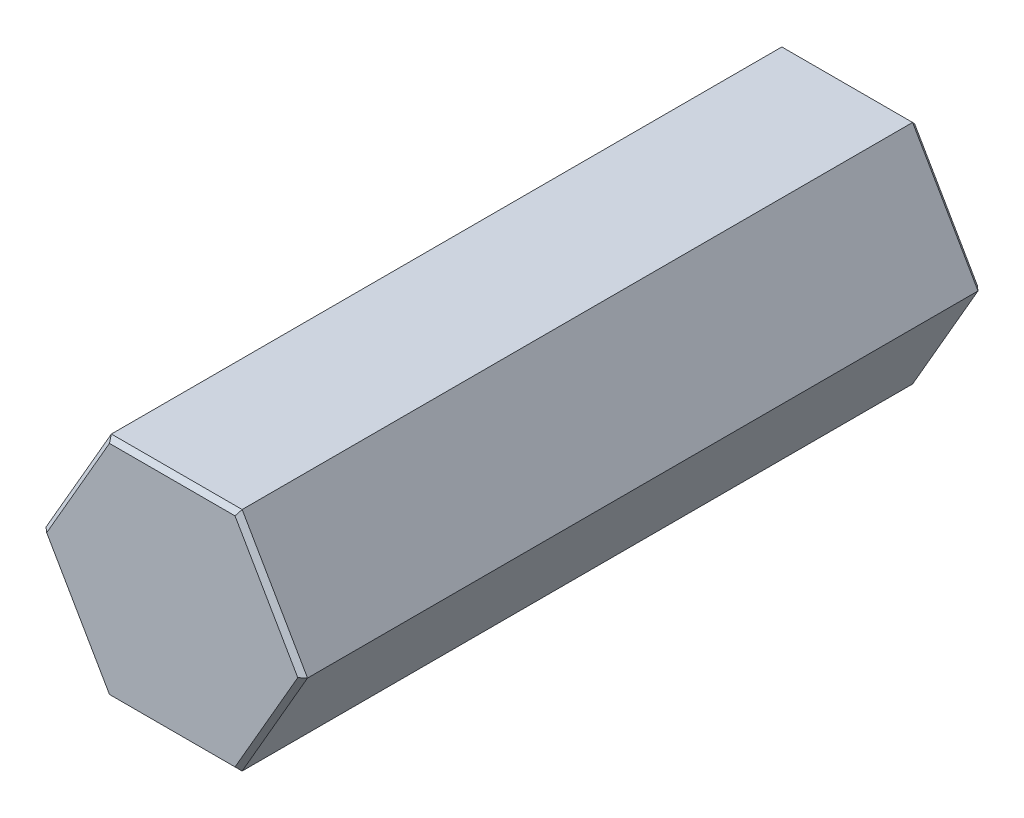
ISO-10303-21;
HEADER;
FILE_DESCRIPTION(('STEP AP214'),'2;1');
FILE_NAME('part.step','',(''),(''),'','','');
FILE_SCHEMA(('AUTOMOTIVE_DESIGN { 1 0 10303 214 1 1 1 1 }'));
ENDSEC;
DATA;
#1=APPLICATION_CONTEXT('core data for automotive mechanical design processes');
#2=APPLICATION_PROTOCOL_DEFINITION('international standard','automotive_design',2000,#1);
#3=PRODUCT_CONTEXT('',#1,'mechanical');
#4=PRODUCT('Part','Part','',(#3));
#5=PRODUCT_RELATED_PRODUCT_CATEGORY('part','',(#4));
#6=PRODUCT_DEFINITION_FORMATION('','',#4);
#7=PRODUCT_DEFINITION_CONTEXT('part definition',#1,'design');
#8=PRODUCT_DEFINITION('design','',#6,#7);
#9=PRODUCT_DEFINITION_SHAPE('','',#8);
#10=(LENGTH_UNIT() NAMED_UNIT(*) SI_UNIT(.MILLI.,.METRE.));
#11=(NAMED_UNIT(*) PLANE_ANGLE_UNIT() SI_UNIT($,.RADIAN.));
#12=(NAMED_UNIT(*) SI_UNIT($,.STERADIAN.) SOLID_ANGLE_UNIT());
#13=UNCERTAINTY_MEASURE_WITH_UNIT(LENGTH_MEASURE(1.E-05),#10,'distance_accuracy_value','');
#14=(GEOMETRIC_REPRESENTATION_CONTEXT(3) GLOBAL_UNCERTAINTY_ASSIGNED_CONTEXT((#13)) GLOBAL_UNIT_ASSIGNED_CONTEXT((#10,
#11,#12)) REPRESENTATION_CONTEXT('',''));
#15=CARTESIAN_POINT('',(0.,0.,0.));
#16=DIRECTION('',(0.,0.,1.));
#17=DIRECTION('',(1.,0.,0.));
#18=AXIS2_PLACEMENT_3D('',#15,#16,#17);
#19=CARTESIAN_POINT('',(-7.33234841870824,0.,38.1));
#20=DIRECTION('',(-0.866025403784439,0.5,0.));
#21=DIRECTION('',(-0.5,-0.866025403784439,0.));
#22=AXIS2_PLACEMENT_3D('',#19,#20,#21);
#23=PLANE('',#22);
#24=DIRECTION('',(0.,0.,-1.));
#25=VECTOR('',#24,1.);
#26=CARTESIAN_POINT('',(-3.66617420935412,6.35,38.1));
#27=LINE('',#26,#25);
#28=CARTESIAN_POINT('',(-3.66617420935412,6.35,37.846));
#29=VERTEX_POINT('',#28);
#30=CARTESIAN_POINT('',(-3.66617420935412,6.35,0.254000000000039));
#31=VERTEX_POINT('',#30);
#32=EDGE_CURVE('E168',#29,#31,#27,.T.);
#33=ORIENTED_EDGE('',*,*,#32,.T.);
#34=DIRECTION('',(-0.5,-0.866025403784439,0.));
#35=VECTOR('',#34,1.);
#36=CARTESIAN_POINT('',(-7.33234841870824,0.,0.254000000000025));
#37=LINE('',#36,#35);
#38=CARTESIAN_POINT('',(-7.33234841870824,0.,0.254000000000039));
#39=VERTEX_POINT('',#38);
#40=EDGE_CURVE('E162',#31,#39,#37,.T.);
#41=ORIENTED_EDGE('',*,*,#40,.T.);
#42=DIRECTION('',(0.,0.,-1.));
#43=VECTOR('',#42,1.);
#44=CARTESIAN_POINT('',(-7.33234841870824,0.,38.1));
#45=LINE('',#44,#43);
#46=CARTESIAN_POINT('',(-7.33234841870824,0.,37.846));
#47=VERTEX_POINT('',#46);
#48=EDGE_CURVE('E159',#47,#39,#45,.T.);
#49=ORIENTED_EDGE('',*,*,#48,.F.);
#50=DIRECTION('',(0.5,0.866025403784439,0.));
#51=VECTOR('',#50,1.);
#52=CARTESIAN_POINT('',(-3.66617420935412,6.35,37.846));
#53=LINE('',#52,#51);
#54=EDGE_CURVE('E235',#47,#29,#53,.T.);
#55=ORIENTED_EDGE('',*,*,#54,.T.);
#56=EDGE_LOOP('',(#33,#41,#49,#55));
#57=FACE_BOUND('',#56,.T.);
#58=ADVANCED_FACE('F41',(#57),#23,.T.);
#59=CARTESIAN_POINT('',(-3.66617420935412,-6.35,38.1));
#60=DIRECTION('',(-0.866025403784439,-0.5,0.));
#61=DIRECTION('',(0.5,-0.866025403784439,0.));
#62=AXIS2_PLACEMENT_3D('',#59,#60,#61);
#63=PLANE('',#62);
#64=ORIENTED_EDGE('',*,*,#48,.T.);
#65=DIRECTION('',(0.5,-0.866025403784439,0.));
#66=VECTOR('',#65,1.);
#67=CARTESIAN_POINT('',(-3.66617420935412,-6.35,0.254000000000025));
#68=LINE('',#67,#66);
#69=CARTESIAN_POINT('',(-3.66617420935412,-6.35,0.254000000000039));
#70=VERTEX_POINT('',#69);
#71=EDGE_CURVE('E215',#39,#70,#68,.T.);
#72=ORIENTED_EDGE('',*,*,#71,.T.);
#73=DIRECTION('',(0.,0.,-1.));
#74=VECTOR('',#73,1.);
#75=CARTESIAN_POINT('',(-3.66617420935412,-6.35,38.1));
#76=LINE('',#75,#74);
#77=CARTESIAN_POINT('',(-3.66617420935412,-6.35,37.846));
#78=VERTEX_POINT('',#77);
#79=EDGE_CURVE('E319',#78,#70,#76,.T.);
#80=ORIENTED_EDGE('',*,*,#79,.F.);
#81=DIRECTION('',(-0.5,0.866025403784439,0.));
#82=VECTOR('',#81,1.);
#83=CARTESIAN_POINT('',(-7.33234841870824,0.,37.846));
#84=LINE('',#83,#82);
#85=EDGE_CURVE('E222',#78,#47,#84,.T.);
#86=ORIENTED_EDGE('',*,*,#85,.T.);
#87=EDGE_LOOP('',(#64,#72,#80,#86));
#88=FACE_BOUND('',#87,.T.);
#89=ADVANCED_FACE('F324',(#88),#63,.T.);
#90=CARTESIAN_POINT('',(3.66617420935413,-6.35,38.1));
#91=DIRECTION('',(0.,-1.,0.));
#92=DIRECTION('',(0.,0.,-1.));
#93=AXIS2_PLACEMENT_3D('',#90,#91,#92);
#94=PLANE('',#93);
#95=ORIENTED_EDGE('',*,*,#79,.T.);
#96=DIRECTION('',(1.,0.,0.));
#97=VECTOR('',#96,1.);
#98=CARTESIAN_POINT('',(3.66617420935413,-6.35,0.254000000000025));
#99=LINE('',#98,#97);
#100=CARTESIAN_POINT('',(3.66617420935413,-6.35,0.254000000000039));
#101=VERTEX_POINT('',#100);
#102=EDGE_CURVE('E268',#70,#101,#99,.T.);
#103=ORIENTED_EDGE('',*,*,#102,.T.);
#104=DIRECTION('',(0.,0.,-1.));
#105=VECTOR('',#104,1.);
#106=CARTESIAN_POINT('',(3.66617420935413,-6.35,38.1));
#107=LINE('',#106,#105);
#108=CARTESIAN_POINT('',(3.66617420935413,-6.35,37.846));
#109=VERTEX_POINT('',#108);
#110=EDGE_CURVE('E289',#109,#101,#107,.T.);
#111=ORIENTED_EDGE('',*,*,#110,.F.);
#112=DIRECTION('',(-1.,0.,0.));
#113=VECTOR('',#112,1.);
#114=CARTESIAN_POINT('',(-3.66617420935412,-6.35,37.846));
#115=LINE('',#114,#113);
#116=EDGE_CURVE('E264',#109,#78,#115,.T.);
#117=ORIENTED_EDGE('',*,*,#116,.T.);
#118=EDGE_LOOP('',(#95,#103,#111,#117));
#119=FACE_BOUND('',#118,.T.);
#120=ADVANCED_FACE('F349',(#119),#94,.T.);
#121=CARTESIAN_POINT('',(7.33234841870825,0.,38.1));
#122=DIRECTION('',(0.866025403784439,-0.5,0.));
#123=DIRECTION('',(0.5,0.866025403784439,0.));
#124=AXIS2_PLACEMENT_3D('',#121,#122,#123);
#125=PLANE('',#124);
#126=ORIENTED_EDGE('',*,*,#110,.T.);
#127=DIRECTION('',(0.5,0.866025403784439,0.));
#128=VECTOR('',#127,1.);
#129=CARTESIAN_POINT('',(7.33234841870825,0.,0.254000000000025));
#130=LINE('',#129,#128);
#131=CARTESIAN_POINT('',(7.33234841870825,0.,0.254000000000039));
#132=VERTEX_POINT('',#131);
#133=EDGE_CURVE('E229',#101,#132,#130,.T.);
#134=ORIENTED_EDGE('',*,*,#133,.T.);
#135=DIRECTION('',(0.,0.,-1.));
#136=VECTOR('',#135,1.);
#137=CARTESIAN_POINT('',(7.33234841870825,0.,38.1));
#138=LINE('',#137,#136);
#139=CARTESIAN_POINT('',(7.33234841870825,0.,37.846));
#140=VERTEX_POINT('',#139);
#141=EDGE_CURVE('E288',#140,#132,#138,.T.);
#142=ORIENTED_EDGE('',*,*,#141,.F.);
#143=DIRECTION('',(-0.5,-0.866025403784439,0.));
#144=VECTOR('',#143,1.);
#145=CARTESIAN_POINT('',(3.66617420935413,-6.35,37.846));
#146=LINE('',#145,#144);
#147=EDGE_CURVE('E274',#140,#109,#146,.T.);
#148=ORIENTED_EDGE('',*,*,#147,.T.);
#149=EDGE_LOOP('',(#126,#134,#142,#148));
#150=FACE_BOUND('',#149,.T.);
#151=ADVANCED_FACE('F287',(#150),#125,.T.);
#152=CARTESIAN_POINT('',(3.66617420935413,6.35,38.1));
#153=DIRECTION('',(0.866025403784439,0.5,0.));
#154=DIRECTION('',(-0.5,0.866025403784439,0.));
#155=AXIS2_PLACEMENT_3D('',#152,#153,#154);
#156=PLANE('',#155);
#157=ORIENTED_EDGE('',*,*,#141,.T.);
#158=DIRECTION('',(-0.5,0.866025403784439,0.));
#159=VECTOR('',#158,1.);
#160=CARTESIAN_POINT('',(3.66617420935413,6.35,0.254000000000025));
#161=LINE('',#160,#159);
#162=CARTESIAN_POINT('',(3.66617420935413,6.35,0.254000000000039));
#163=VERTEX_POINT('',#162);
#164=EDGE_CURVE('E226',#132,#163,#161,.T.);
#165=ORIENTED_EDGE('',*,*,#164,.T.);
#166=DIRECTION('',(0.,0.,-1.));
#167=VECTOR('',#166,1.);
#168=CARTESIAN_POINT('',(3.66617420935413,6.35,38.1));
#169=LINE('',#168,#167);
#170=CARTESIAN_POINT('',(3.66617420935413,6.35,37.846));
#171=VERTEX_POINT('',#170);
#172=EDGE_CURVE('E299',#171,#163,#169,.T.);
#173=ORIENTED_EDGE('',*,*,#172,.F.);
#174=DIRECTION('',(0.5,-0.866025403784439,0.));
#175=VECTOR('',#174,1.);
#176=CARTESIAN_POINT('',(7.33234841870825,0.,37.846));
#177=LINE('',#176,#175);
#178=EDGE_CURVE('E221',#171,#140,#177,.T.);
#179=ORIENTED_EDGE('',*,*,#178,.T.);
#180=EDGE_LOOP('',(#157,#165,#173,#179));
#181=FACE_BOUND('',#180,.T.);
#182=ADVANCED_FACE('F294',(#181),#156,.T.);
#183=CARTESIAN_POINT('',(-3.66617420935412,6.35,38.1));
#184=DIRECTION('',(0.,1.,0.));
#185=DIRECTION('',(0.,0.,1.));
#186=AXIS2_PLACEMENT_3D('',#183,#184,#185);
#187=PLANE('',#186);
#188=ORIENTED_EDGE('',*,*,#172,.T.);
#189=DIRECTION('',(-1.,0.,0.));
#190=VECTOR('',#189,1.);
#191=CARTESIAN_POINT('',(-3.66617420935412,6.35,0.254000000000025));
#192=LINE('',#191,#190);
#193=EDGE_CURVE('E243',#163,#31,#192,.T.);
#194=ORIENTED_EDGE('',*,*,#193,.T.);
#195=ORIENTED_EDGE('',*,*,#32,.F.);
#196=DIRECTION('',(1.,0.,0.));
#197=VECTOR('',#196,1.);
#198=CARTESIAN_POINT('',(3.66617420935413,6.35,37.846));
#199=LINE('',#198,#197);
#200=EDGE_CURVE('E240',#29,#171,#199,.T.);
#201=ORIENTED_EDGE('',*,*,#200,.T.);
#202=EDGE_LOOP('',(#188,#194,#195,#201));
#203=FACE_BOUND('',#202,.T.);
#204=ADVANCED_FACE('F329',(#203),#187,.T.);
#205=CARTESIAN_POINT('',(0.,0.,38.1));
#206=DIRECTION('',(0.,0.,-1.));
#207=DIRECTION('',(-1.,0.,0.));
#208=AXIS2_PLACEMENT_3D('',#205,#206,#207);
#209=PLANE('',#208);
#210=DIRECTION('',(-0.5,-0.866025403784439,0.));
#211=VECTOR('',#210,1.);
#212=CARTESIAN_POINT('',(-7.11237796614697,-0.127000000000012,38.1));
#213=LINE('',#212,#211);
#214=CARTESIAN_POINT('',(-3.51952724097994,6.09599999999997,38.1));
#215=VERTEX_POINT('',#214);
#216=CARTESIAN_POINT('',(-7.03905448195988,0.,38.1));
#217=VERTEX_POINT('',#216);
#218=EDGE_CURVE('E67',#215,#217,#213,.T.);
#219=ORIENTED_EDGE('',*,*,#218,.T.);
#220=DIRECTION('',(0.5,-0.866025403784439,0.));
#221=VECTOR('',#220,1.);
#222=CARTESIAN_POINT('',(-3.44620375679284,-6.22299999999998,38.1));
#223=LINE('',#222,#221);
#224=CARTESIAN_POINT('',(-3.51952724097994,-6.09599999999997,38.1));
#225=VERTEX_POINT('',#224);
#226=EDGE_CURVE('E11',#217,#225,#223,.T.);
#227=ORIENTED_EDGE('',*,*,#226,.T.);
#228=DIRECTION('',(1.,0.,0.));
#229=VECTOR('',#228,1.);
#230=CARTESIAN_POINT('',(3.66617420935413,-6.09599999999997,38.1));
#231=LINE('',#230,#229);
#232=CARTESIAN_POINT('',(3.51952724097994,-6.09599999999997,38.1));
#233=VERTEX_POINT('',#232);
#234=EDGE_CURVE('E52',#225,#233,#231,.T.);
#235=ORIENTED_EDGE('',*,*,#234,.T.);
#236=DIRECTION('',(0.5,0.866025403784439,0.));
#237=VECTOR('',#236,1.);
#238=CARTESIAN_POINT('',(7.11237796614698,0.127000000000017,38.1));
#239=LINE('',#238,#237);
#240=CARTESIAN_POINT('',(7.03905448195989,0.,38.1));
#241=VERTEX_POINT('',#240);
#242=EDGE_CURVE('E252',#233,#241,#239,.T.);
#243=ORIENTED_EDGE('',*,*,#242,.T.);
#244=DIRECTION('',(-0.5,0.866025403784439,0.));
#245=VECTOR('',#244,1.);
#246=CARTESIAN_POINT('',(3.44620375679286,6.22299999999999,38.1));
#247=LINE('',#246,#245);
#248=CARTESIAN_POINT('',(3.51952724097995,6.09599999999997,38.1));
#249=VERTEX_POINT('',#248);
#250=EDGE_CURVE('E246',#241,#249,#247,.T.);
#251=ORIENTED_EDGE('',*,*,#250,.T.);
#252=DIRECTION('',(-1.,0.,0.));
#253=VECTOR('',#252,1.);
#254=CARTESIAN_POINT('',(-3.66617420935412,6.09599999999997,38.1));
#255=LINE('',#254,#253);
#256=EDGE_CURVE('E249',#249,#215,#255,.T.);
#257=ORIENTED_EDGE('',*,*,#256,.T.);
#258=EDGE_LOOP('',(#219,#227,#235,#243,#251,#257));
#259=FACE_BOUND('',#258,.T.);
#260=ADVANCED_FACE('F257',(#259),#209,.F.);
#261=CARTESIAN_POINT('',(0.,0.,0.));
#262=DIRECTION('',(0.,0.,-1.));
#263=DIRECTION('',(-1.,0.,0.));
#264=AXIS2_PLACEMENT_3D('',#261,#262,#263);
#265=PLANE('',#264);
#266=DIRECTION('',(-0.5,-0.866025403784439,0.));
#267=VECTOR('',#266,1.);
#268=CARTESIAN_POINT('',(5.27929086146992,-3.04799999999999,0.));
#269=LINE('',#268,#267);
#270=CARTESIAN_POINT('',(7.03905448195989,0.,0.));
#271=VERTEX_POINT('',#270);
#272=CARTESIAN_POINT('',(3.51952724097995,-6.09599999999997,0.));
#273=VERTEX_POINT('',#272);
#274=EDGE_CURVE('E276',#271,#273,#269,.T.);
#275=ORIENTED_EDGE('',*,*,#274,.T.);
#276=DIRECTION('',(-1.,0.,0.));
#277=VECTOR('',#276,1.);
#278=CARTESIAN_POINT('',(0.,-6.09599999999997,0.));
#279=LINE('',#278,#277);
#280=CARTESIAN_POINT('',(-3.51952724097994,-6.09599999999997,0.));
#281=VERTEX_POINT('',#280);
#282=EDGE_CURVE('E269',#273,#281,#279,.T.);
#283=ORIENTED_EDGE('',*,*,#282,.T.);
#284=DIRECTION('',(-0.5,0.866025403784439,0.));
#285=VECTOR('',#284,1.);
#286=CARTESIAN_POINT('',(-5.27929086146991,-3.04799999999998,0.));
#287=LINE('',#286,#285);
#288=CARTESIAN_POINT('',(-7.03905448195988,0.,0.));
#289=VERTEX_POINT('',#288);
#290=EDGE_CURVE('E141',#281,#289,#287,.T.);
#291=ORIENTED_EDGE('',*,*,#290,.T.);
#292=DIRECTION('',(0.5,0.866025403784439,0.));
#293=VECTOR('',#292,1.);
#294=CARTESIAN_POINT('',(-5.27929086146991,3.04799999999999,0.));
#295=LINE('',#294,#293);
#296=CARTESIAN_POINT('',(-3.51952724097994,6.09599999999997,0.));
#297=VERTEX_POINT('',#296);
#298=EDGE_CURVE('E134',#289,#297,#295,.T.);
#299=ORIENTED_EDGE('',*,*,#298,.T.);
#300=DIRECTION('',(1.,0.,0.));
#301=VECTOR('',#300,1.);
#302=CARTESIAN_POINT('',(0.,6.09599999999997,0.));
#303=LINE('',#302,#301);
#304=CARTESIAN_POINT('',(3.51952724097995,6.09599999999997,0.));
#305=VERTEX_POINT('',#304);
#306=EDGE_CURVE('E137',#297,#305,#303,.T.);
#307=ORIENTED_EDGE('',*,*,#306,.T.);
#308=DIRECTION('',(0.5,-0.866025403784439,0.));
#309=VECTOR('',#308,1.);
#310=CARTESIAN_POINT('',(5.27929086146992,3.04799999999999,0.));
#311=LINE('',#310,#309);
#312=EDGE_CURVE('E147',#305,#271,#311,.T.);
#313=ORIENTED_EDGE('',*,*,#312,.T.);
#314=EDGE_LOOP('',(#275,#283,#291,#299,#307,#313));
#315=FACE_BOUND('',#314,.T.);
#316=ADVANCED_FACE('F136',(#315),#265,.T.);
#317=CARTESIAN_POINT('',(0.,6.09599999999997,0.));
#318=DIRECTION('',(0.,-0.707106781186547,0.707106781186547));
#319=DIRECTION('',(1.,0.,0.));
#320=AXIS2_PLACEMENT_3D('',#317,#318,#319);
#321=PLANE('',#320);
#322=DIRECTION('',(-0.377964473009225,0.654653670707978,0.654653670707978));
#323=VECTOR('',#322,1.);
#324=CARTESIAN_POINT('',(-3.01673763512567,5.22514285714284,-0.870857142857134));
#325=LINE('',#324,#323);
#326=EDGE_CURVE('E153',#31,#297,#325,.F.);
#327=ORIENTED_EDGE('',*,*,#326,.F.);
#328=ORIENTED_EDGE('',*,*,#193,.F.);
#329=DIRECTION('',(-0.377964473009229,-0.654653670707977,-0.654653670707977));
#330=VECTOR('',#329,1.);
#331=CARTESIAN_POINT('',(3.01673763512567,5.22514285714283,-0.870857142857144));
#332=LINE('',#331,#330);
#333=EDGE_CURVE('E156',#305,#163,#332,.F.);
#334=ORIENTED_EDGE('',*,*,#333,.F.);
#335=ORIENTED_EDGE('',*,*,#306,.F.);
#336=EDGE_LOOP('',(#327,#328,#334,#335));
#337=FACE_BOUND('',#336,.T.);
#338=ADVANCED_FACE('F151',(#337),#321,.F.);
#339=CARTESIAN_POINT('',(5.27929086146992,3.04799999999999,0.));
#340=DIRECTION('',(-0.612372435695794,-0.353553390593273,0.707106781186548));
#341=DIRECTION('',(0.5,-0.866025403784439,0.));
#342=AXIS2_PLACEMENT_3D('',#339,#340,#341);
#343=PLANE('',#342);
#344=ORIENTED_EDGE('',*,*,#333,.T.);
#345=ORIENTED_EDGE('',*,*,#164,.F.);
#346=DIRECTION('',(-0.755928946018455,0.,-0.654653670707977));
#347=VECTOR('',#346,1.);
#348=CARTESIAN_POINT('',(6.03347527025134,0.,-0.870857142857132));
#349=LINE('',#348,#347);
#350=EDGE_CURVE('E164',#271,#132,#349,.F.);
#351=ORIENTED_EDGE('',*,*,#350,.F.);
#352=ORIENTED_EDGE('',*,*,#312,.F.);
#353=EDGE_LOOP('',(#344,#345,#351,#352));
#354=FACE_BOUND('',#353,.T.);
#355=ADVANCED_FACE('F303',(#354),#343,.F.);
#356=CARTESIAN_POINT('',(-5.27929086146991,3.04799999999999,0.));
#357=DIRECTION('',(0.612372435695796,-0.353553390593274,0.707106781186546));
#358=DIRECTION('',(0.5,0.866025403784439,0.));
#359=AXIS2_PLACEMENT_3D('',#356,#357,#358);
#360=PLANE('',#359);
#361=ORIENTED_EDGE('',*,*,#326,.T.);
#362=ORIENTED_EDGE('',*,*,#298,.F.);
#363=DIRECTION('',(-0.755928946018454,0.,0.654653670707977));
#364=VECTOR('',#363,1.);
#365=CARTESIAN_POINT('',(-6.03347527025132,0.,-0.870857142857146));
#366=LINE('',#365,#364);
#367=EDGE_CURVE('E171',#39,#289,#366,.F.);
#368=ORIENTED_EDGE('',*,*,#367,.F.);
#369=ORIENTED_EDGE('',*,*,#40,.F.);
#370=EDGE_LOOP('',(#361,#362,#368,#369));
#371=FACE_BOUND('',#370,.T.);
#372=ADVANCED_FACE('F161',(#371),#360,.F.);
#373=CARTESIAN_POINT('',(5.27929086146992,-3.04799999999999,0.));
#374=DIRECTION('',(-0.612372435695795,0.353553390593274,0.707106781186547));
#375=DIRECTION('',(-0.5,-0.866025403784439,0.));
#376=AXIS2_PLACEMENT_3D('',#373,#374,#375);
#377=PLANE('',#376);
#378=ORIENTED_EDGE('',*,*,#350,.T.);
#379=ORIENTED_EDGE('',*,*,#133,.F.);
#380=DIRECTION('',(-0.377964473009226,0.654653670707978,-0.654653670707978));
#381=VECTOR('',#380,1.);
#382=CARTESIAN_POINT('',(3.01673763512567,-5.22514285714283,-0.870857142857143));
#383=LINE('',#382,#381);
#384=EDGE_CURVE('E202',#273,#101,#383,.F.);
#385=ORIENTED_EDGE('',*,*,#384,.F.);
#386=ORIENTED_EDGE('',*,*,#274,.F.);
#387=EDGE_LOOP('',(#378,#379,#385,#386));
#388=FACE_BOUND('',#387,.T.);
#389=ADVANCED_FACE('F305',(#388),#377,.F.);
#390=CARTESIAN_POINT('',(-5.27929086146991,-3.04799999999998,0.));
#391=DIRECTION('',(0.612372435695794,0.353553390593273,0.707106781186548));
#392=DIRECTION('',(-0.5,0.866025403784439,0.));
#393=AXIS2_PLACEMENT_3D('',#390,#391,#392);
#394=PLANE('',#393);
#395=ORIENTED_EDGE('',*,*,#367,.T.);
#396=ORIENTED_EDGE('',*,*,#290,.F.);
#397=DIRECTION('',(-0.377964473009229,-0.654653670707977,0.654653670707977));
#398=VECTOR('',#397,1.);
#399=CARTESIAN_POINT('',(-3.01673763512566,-5.22514285714284,-0.870857142857137));
#400=LINE('',#399,#398);
#401=EDGE_CURVE('E196',#70,#281,#400,.F.);
#402=ORIENTED_EDGE('',*,*,#401,.F.);
#403=ORIENTED_EDGE('',*,*,#71,.F.);
#404=EDGE_LOOP('',(#395,#396,#402,#403));
#405=FACE_BOUND('',#404,.T.);
#406=ADVANCED_FACE('F214',(#405),#394,.F.);
#407=CARTESIAN_POINT('',(0.,-6.09599999999997,0.));
#408=DIRECTION('',(0.,0.707106781186547,0.707106781186547));
#409=DIRECTION('',(-1.,0.,0.));
#410=AXIS2_PLACEMENT_3D('',#407,#408,#409);
#411=PLANE('',#410);
#412=ORIENTED_EDGE('',*,*,#384,.T.);
#413=ORIENTED_EDGE('',*,*,#102,.F.);
#414=ORIENTED_EDGE('',*,*,#401,.T.);
#415=ORIENTED_EDGE('',*,*,#282,.F.);
#416=EDGE_LOOP('',(#412,#413,#414,#415));
#417=FACE_BOUND('',#416,.T.);
#418=ADVANCED_FACE('F355',(#417),#411,.F.);
#419=CARTESIAN_POINT('',(3.66617420935413,6.35,37.846));
#420=DIRECTION('',(0.612372435695806,0.35355339059328,0.707106781186535));
#421=DIRECTION('',(-0.5,0.866025403784439,0.));
#422=AXIS2_PLACEMENT_3D('',#419,#420,#421);
#423=PLANE('',#422);
#424=DIRECTION('',(-0.377964473009223,-0.654653670707965,0.654653670707992));
#425=VECTOR('',#424,1.);
#426=CARTESIAN_POINT('',(3.66617420935413,6.35,37.846));
#427=LINE('',#426,#425);
#428=EDGE_CURVE('E187',#249,#171,#427,.F.);
#429=ORIENTED_EDGE('',*,*,#428,.F.);
#430=ORIENTED_EDGE('',*,*,#250,.F.);
#431=DIRECTION('',(0.755928946018442,0.,-0.654653670707992));
#432=VECTOR('',#431,1.);
#433=CARTESIAN_POINT('',(5.23739172764884,0.,39.6602857142857));
#434=LINE('',#433,#432);
#435=EDGE_CURVE('E46',#140,#241,#434,.F.);
#436=ORIENTED_EDGE('',*,*,#435,.F.);
#437=ORIENTED_EDGE('',*,*,#178,.F.);
#438=EDGE_LOOP('',(#429,#430,#436,#437));
#439=FACE_BOUND('',#438,.T.);
#440=ADVANCED_FACE('F44',(#439),#423,.T.);
#441=CARTESIAN_POINT('',(7.33234841870825,0.,37.846));
#442=DIRECTION('',(0.612372435695808,-0.353553390593281,0.707106781186533));
#443=DIRECTION('',(0.5,0.866025403784439,0.));
#444=AXIS2_PLACEMENT_3D('',#441,#442,#443);
#445=PLANE('',#444);
#446=ORIENTED_EDGE('',*,*,#435,.T.);
#447=ORIENTED_EDGE('',*,*,#242,.F.);
#448=DIRECTION('',(0.37796447300922,-0.654653670707966,-0.654653670707993));
#449=VECTOR('',#448,1.);
#450=CARTESIAN_POINT('',(2.61869586382441,-4.53571428571435,39.6602857142857));
#451=LINE('',#450,#449);
#452=EDGE_CURVE('E184',#109,#233,#451,.F.);
#453=ORIENTED_EDGE('',*,*,#452,.F.);
#454=ORIENTED_EDGE('',*,*,#147,.F.);
#455=EDGE_LOOP('',(#446,#447,#453,#454));
#456=FACE_BOUND('',#455,.T.);
#457=ADVANCED_FACE('F261',(#456),#445,.T.);
#458=CARTESIAN_POINT('',(-3.66617420935412,6.35,37.846));
#459=DIRECTION('',(0.,0.707106781186562,0.707106781186533));
#460=DIRECTION('',(-1.,0.,0.));
#461=AXIS2_PLACEMENT_3D('',#458,#459,#460);
#462=PLANE('',#461);
#463=ORIENTED_EDGE('',*,*,#428,.T.);
#464=ORIENTED_EDGE('',*,*,#200,.F.);
#465=DIRECTION('',(0.37796447300922,-0.654653670707966,0.654653670707993));
#466=VECTOR('',#465,1.);
#467=CARTESIAN_POINT('',(-3.66617420935412,6.35,37.846));
#468=LINE('',#467,#466);
#469=EDGE_CURVE('E180',#215,#29,#468,.F.);
#470=ORIENTED_EDGE('',*,*,#469,.F.);
#471=ORIENTED_EDGE('',*,*,#256,.F.);
#472=EDGE_LOOP('',(#463,#464,#470,#471));
#473=FACE_BOUND('',#472,.T.);
#474=ADVANCED_FACE('F331',(#473),#462,.T.);
#475=CARTESIAN_POINT('',(3.66617420935413,-6.35,37.846));
#476=DIRECTION('',(0.,-0.707106781186562,0.707106781186533));
#477=DIRECTION('',(1.,0.,0.));
#478=AXIS2_PLACEMENT_3D('',#475,#476,#477);
#479=PLANE('',#478);
#480=ORIENTED_EDGE('',*,*,#452,.T.);
#481=ORIENTED_EDGE('',*,*,#234,.F.);
#482=DIRECTION('',(-0.377964473009224,-0.654653670707965,-0.654653670707991));
#483=VECTOR('',#482,1.);
#484=CARTESIAN_POINT('',(-2.61869586382439,-4.53571428571434,39.6602857142857));
#485=LINE('',#484,#483);
#486=EDGE_CURVE('E60',#78,#225,#485,.F.);
#487=ORIENTED_EDGE('',*,*,#486,.F.);
#488=ORIENTED_EDGE('',*,*,#116,.F.);
#489=EDGE_LOOP('',(#480,#481,#487,#488));
#490=FACE_BOUND('',#489,.T.);
#491=ADVANCED_FACE('F263',(#490),#479,.T.);
#492=CARTESIAN_POINT('',(-7.33234841870824,0.,37.846));
#493=DIRECTION('',(-0.612372435695807,0.353553390593281,0.707106781186533));
#494=DIRECTION('',(-0.5,-0.866025403784439,0.));
#495=AXIS2_PLACEMENT_3D('',#492,#493,#494);
#496=PLANE('',#495);
#497=ORIENTED_EDGE('',*,*,#469,.T.);
#498=ORIENTED_EDGE('',*,*,#54,.F.);
#499=DIRECTION('',(0.755928946018442,0.,0.654653670707992));
#500=VECTOR('',#499,1.);
#501=CARTESIAN_POINT('',(-7.33234841870824,0.,37.846));
#502=LINE('',#501,#500);
#503=EDGE_CURVE('E175',#217,#47,#502,.F.);
#504=ORIENTED_EDGE('',*,*,#503,.F.);
#505=ORIENTED_EDGE('',*,*,#218,.F.);
#506=EDGE_LOOP('',(#497,#498,#504,#505));
#507=FACE_BOUND('',#506,.T.);
#508=ADVANCED_FACE('F333',(#507),#496,.T.);
#509=CARTESIAN_POINT('',(-3.66617420935412,-6.35,37.846));
#510=DIRECTION('',(-0.612372435695806,-0.35355339059328,0.707106781186535));
#511=DIRECTION('',(0.5,-0.866025403784439,0.));
#512=AXIS2_PLACEMENT_3D('',#509,#510,#511);
#513=PLANE('',#512);
#514=ORIENTED_EDGE('',*,*,#486,.T.);
#515=ORIENTED_EDGE('',*,*,#226,.F.);
#516=ORIENTED_EDGE('',*,*,#503,.T.);
#517=ORIENTED_EDGE('',*,*,#85,.F.);
#518=EDGE_LOOP('',(#514,#515,#516,#517));
#519=FACE_BOUND('',#518,.T.);
#520=ADVANCED_FACE('F335',(#519),#513,.T.);
#521=CLOSED_SHELL('',(#58,#89,#120,#151,#182,#204,#260,#316,#338,#355,#372,#389,#406,#418,#440,
#457,#474,#491,#508,#520));
#522=MANIFOLD_SOLID_BREP('B2',#521);
#523=ADVANCED_BREP_SHAPE_REPRESENTATION('',(#18,#522),#14);
#524=SHAPE_DEFINITION_REPRESENTATION(#9,#523);
ENDSEC;
END-ISO-10303-21;
